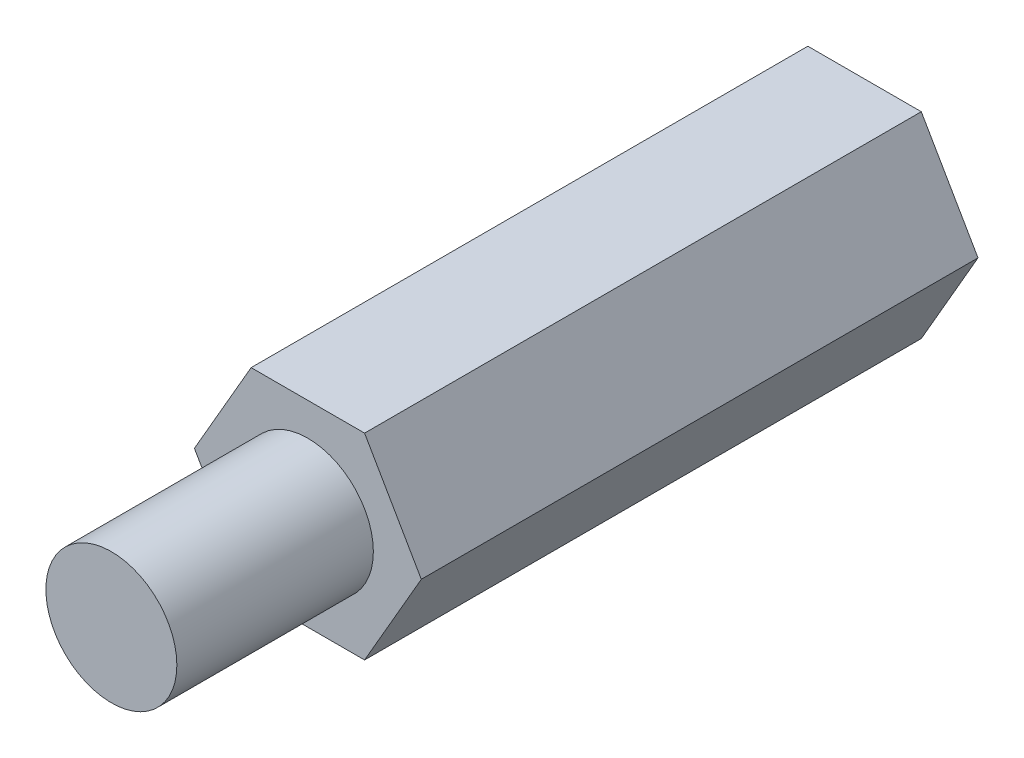
ISO-10303-21;
HEADER;
FILE_DESCRIPTION(('STEP AP214'),'2;1');
FILE_NAME('part.step','',(''),(''),'','','');
FILE_SCHEMA(('AUTOMOTIVE_DESIGN { 1 0 10303 214 1 1 1 1 }'));
ENDSEC;
DATA;
#1=APPLICATION_CONTEXT('core data for automotive mechanical design processes');
#2=APPLICATION_PROTOCOL_DEFINITION('international standard','automotive_design',2000,#1);
#3=PRODUCT_CONTEXT('',#1,'mechanical');
#4=PRODUCT('Part','Part','',(#3));
#5=PRODUCT_RELATED_PRODUCT_CATEGORY('part','',(#4));
#6=PRODUCT_DEFINITION_FORMATION('','',#4);
#7=PRODUCT_DEFINITION_CONTEXT('part definition',#1,'design');
#8=PRODUCT_DEFINITION('design','',#6,#7);
#9=PRODUCT_DEFINITION_SHAPE('','',#8);
#10=(LENGTH_UNIT() NAMED_UNIT(*) SI_UNIT(.MILLI.,.METRE.));
#11=(NAMED_UNIT(*) PLANE_ANGLE_UNIT() SI_UNIT($,.RADIAN.));
#12=(NAMED_UNIT(*) SI_UNIT($,.STERADIAN.) SOLID_ANGLE_UNIT());
#13=UNCERTAINTY_MEASURE_WITH_UNIT(LENGTH_MEASURE(1.E-05),#10,'distance_accuracy_value','');
#14=(GEOMETRIC_REPRESENTATION_CONTEXT(3) GLOBAL_UNCERTAINTY_ASSIGNED_CONTEXT((#13)) GLOBAL_UNIT_ASSIGNED_CONTEXT((#10,
#11,#12)) REPRESENTATION_CONTEXT('',''));
#15=CARTESIAN_POINT('',(0.,0.,0.));
#16=DIRECTION('',(0.,0.,1.));
#17=DIRECTION('',(1.,0.,0.));
#18=AXIS2_PLACEMENT_3D('',#15,#16,#17);
#19=CARTESIAN_POINT('',(3.46410161513775,0.,17.));
#20=DIRECTION('',(-0.866025403784439,-0.5,0.));
#21=DIRECTION('',(0.5,-0.866025403784438,0.));
#22=AXIS2_PLACEMENT_3D('',#19,#20,#21);
#23=PLANE('',#22);
#24=DIRECTION('',(-0.5,0.866025403784438,0.));
#25=VECTOR('',#24,1.);
#26=CARTESIAN_POINT('',(3.46410161513775,0.,0.));
#27=LINE('',#26,#25);
#28=CARTESIAN_POINT('',(3.46410161513775,0.,0.));
#29=VERTEX_POINT('',#28);
#30=CARTESIAN_POINT('',(1.73205080756888,3.,0.));
#31=VERTEX_POINT('',#30);
#32=EDGE_CURVE('E121',#29,#31,#27,.T.);
#33=ORIENTED_EDGE('',*,*,#32,.T.);
#34=DIRECTION('',(0.,0.,-1.));
#35=VECTOR('',#34,1.);
#36=CARTESIAN_POINT('',(1.73205080756888,3.,17.));
#37=LINE('',#36,#35);
#38=CARTESIAN_POINT('',(1.73205080756888,3.,17.));
#39=VERTEX_POINT('',#38);
#40=EDGE_CURVE('E36',#39,#31,#37,.T.);
#41=ORIENTED_EDGE('',*,*,#40,.F.);
#42=DIRECTION('',(-0.5,0.866025403784438,0.));
#43=VECTOR('',#42,1.);
#44=CARTESIAN_POINT('',(3.46410161513775,0.,17.));
#45=LINE('',#44,#43);
#46=CARTESIAN_POINT('',(3.46410161513775,0.,17.));
#47=VERTEX_POINT('',#46);
#48=EDGE_CURVE('E132',#47,#39,#45,.T.);
#49=ORIENTED_EDGE('',*,*,#48,.F.);
#50=DIRECTION('',(0.,0.,-1.));
#51=VECTOR('',#50,1.);
#52=CARTESIAN_POINT('',(3.46410161513775,0.,17.));
#53=LINE('',#52,#51);
#54=EDGE_CURVE('E117',#47,#29,#53,.T.);
#55=ORIENTED_EDGE('',*,*,#54,.T.);
#56=EDGE_LOOP('',(#33,#41,#49,#55));
#57=FACE_BOUND('',#56,.T.);
#58=ADVANCED_FACE('F33',(#57),#23,.F.);
#59=CARTESIAN_POINT('',(1.73205080756888,3.,17.));
#60=DIRECTION('',(0.,-1.,0.));
#61=DIRECTION('',(0.,0.,-1.));
#62=AXIS2_PLACEMENT_3D('',#59,#60,#61);
#63=PLANE('',#62);
#64=DIRECTION('',(-1.,0.,0.));
#65=VECTOR('',#64,1.);
#66=CARTESIAN_POINT('',(1.73205080756888,3.,0.));
#67=LINE('',#66,#65);
#68=CARTESIAN_POINT('',(-1.73205080756888,3.,0.));
#69=VERTEX_POINT('',#68);
#70=EDGE_CURVE('E124',#31,#69,#67,.T.);
#71=ORIENTED_EDGE('',*,*,#70,.T.);
#72=DIRECTION('',(0.,0.,-1.));
#73=VECTOR('',#72,1.);
#74=CARTESIAN_POINT('',(-1.73205080756888,3.,17.));
#75=LINE('',#74,#73);
#76=CARTESIAN_POINT('',(-1.73205080756888,3.,17.));
#77=VERTEX_POINT('',#76);
#78=EDGE_CURVE('E135',#77,#69,#75,.T.);
#79=ORIENTED_EDGE('',*,*,#78,.F.);
#80=DIRECTION('',(-1.,0.,0.));
#81=VECTOR('',#80,1.);
#82=CARTESIAN_POINT('',(1.73205080756888,3.,17.));
#83=LINE('',#82,#81);
#84=EDGE_CURVE('E89',#39,#77,#83,.T.);
#85=ORIENTED_EDGE('',*,*,#84,.F.);
#86=ORIENTED_EDGE('',*,*,#40,.T.);
#87=EDGE_LOOP('',(#71,#79,#85,#86));
#88=FACE_BOUND('',#87,.T.);
#89=ADVANCED_FACE('F140',(#88),#63,.F.);
#90=CARTESIAN_POINT('',(-1.73205080756888,3.,17.));
#91=DIRECTION('',(0.866025403784439,-0.5,0.));
#92=DIRECTION('',(0.5,0.866025403784439,0.));
#93=AXIS2_PLACEMENT_3D('',#90,#91,#92);
#94=PLANE('',#93);
#95=DIRECTION('',(-0.499999999999999,-0.866025403784439,0.));
#96=VECTOR('',#95,1.);
#97=CARTESIAN_POINT('',(-1.73205080756888,3.,0.));
#98=LINE('',#97,#96);
#99=CARTESIAN_POINT('',(-3.46410161513775,0.,0.));
#100=VERTEX_POINT('',#99);
#101=EDGE_CURVE('E127',#69,#100,#98,.T.);
#102=ORIENTED_EDGE('',*,*,#101,.T.);
#103=DIRECTION('',(0.,0.,-1.));
#104=VECTOR('',#103,1.);
#105=CARTESIAN_POINT('',(-3.46410161513775,0.,17.));
#106=LINE('',#105,#104);
#107=CARTESIAN_POINT('',(-3.46410161513775,0.,17.));
#108=VERTEX_POINT('',#107);
#109=EDGE_CURVE('E112',#108,#100,#106,.T.);
#110=ORIENTED_EDGE('',*,*,#109,.F.);
#111=DIRECTION('',(-0.499999999999999,-0.866025403784439,0.));
#112=VECTOR('',#111,1.);
#113=CARTESIAN_POINT('',(-1.73205080756888,3.,17.));
#114=LINE('',#113,#112);
#115=EDGE_CURVE('E103',#77,#108,#114,.T.);
#116=ORIENTED_EDGE('',*,*,#115,.F.);
#117=ORIENTED_EDGE('',*,*,#78,.T.);
#118=EDGE_LOOP('',(#102,#110,#116,#117));
#119=FACE_BOUND('',#118,.T.);
#120=ADVANCED_FACE('F146',(#119),#94,.F.);
#121=CARTESIAN_POINT('',(-3.46410161513775,0.,17.));
#122=DIRECTION('',(0.866025403784438,0.5,0.));
#123=DIRECTION('',(-0.5,0.866025403784438,0.));
#124=AXIS2_PLACEMENT_3D('',#121,#122,#123);
#125=PLANE('',#124);
#126=DIRECTION('',(0.5,-0.866025403784438,0.));
#127=VECTOR('',#126,1.);
#128=CARTESIAN_POINT('',(-3.46410161513775,0.,0.));
#129=LINE('',#128,#127);
#130=CARTESIAN_POINT('',(-1.73205080756887,-3.,0.));
#131=VERTEX_POINT('',#130);
#132=EDGE_CURVE('E111',#100,#131,#129,.T.);
#133=ORIENTED_EDGE('',*,*,#132,.T.);
#134=DIRECTION('',(0.,0.,-1.));
#135=VECTOR('',#134,1.);
#136=CARTESIAN_POINT('',(-1.73205080756887,-3.,17.));
#137=LINE('',#136,#135);
#138=CARTESIAN_POINT('',(-1.73205080756887,-3.,17.));
#139=VERTEX_POINT('',#138);
#140=EDGE_CURVE('E108',#139,#131,#137,.T.);
#141=ORIENTED_EDGE('',*,*,#140,.F.);
#142=DIRECTION('',(0.5,-0.866025403784438,0.));
#143=VECTOR('',#142,1.);
#144=CARTESIAN_POINT('',(-3.46410161513775,0.,17.));
#145=LINE('',#144,#143);
#146=EDGE_CURVE('E97',#108,#139,#145,.T.);
#147=ORIENTED_EDGE('',*,*,#146,.F.);
#148=ORIENTED_EDGE('',*,*,#109,.T.);
#149=EDGE_LOOP('',(#133,#141,#147,#148));
#150=FACE_BOUND('',#149,.T.);
#151=ADVANCED_FACE('F109',(#150),#125,.F.);
#152=CARTESIAN_POINT('',(-1.73205080756887,-3.,17.));
#153=DIRECTION('',(0.,1.,0.));
#154=DIRECTION('',(-1.,0.,0.));
#155=AXIS2_PLACEMENT_3D('',#152,#153,#154);
#156=PLANE('',#155);
#157=DIRECTION('',(1.,0.,0.));
#158=VECTOR('',#157,1.);
#159=CARTESIAN_POINT('',(-1.73205080756887,-3.,0.));
#160=LINE('',#159,#158);
#161=CARTESIAN_POINT('',(1.73205080756888,-3.,0.));
#162=VERTEX_POINT('',#161);
#163=EDGE_CURVE('E74',#131,#162,#160,.T.);
#164=ORIENTED_EDGE('',*,*,#163,.T.);
#165=DIRECTION('',(0.,0.,-1.));
#166=VECTOR('',#165,1.);
#167=CARTESIAN_POINT('',(1.73205080756888,-3.,17.));
#168=LINE('',#167,#166);
#169=CARTESIAN_POINT('',(1.73205080756888,-3.,17.));
#170=VERTEX_POINT('',#169);
#171=EDGE_CURVE('E113',#170,#162,#168,.T.);
#172=ORIENTED_EDGE('',*,*,#171,.F.);
#173=DIRECTION('',(1.,0.,0.));
#174=VECTOR('',#173,1.);
#175=CARTESIAN_POINT('',(-1.73205080756887,-3.,17.));
#176=LINE('',#175,#174);
#177=EDGE_CURVE('E101',#139,#170,#176,.T.);
#178=ORIENTED_EDGE('',*,*,#177,.F.);
#179=ORIENTED_EDGE('',*,*,#140,.T.);
#180=EDGE_LOOP('',(#164,#172,#178,#179));
#181=FACE_BOUND('',#180,.T.);
#182=ADVANCED_FACE('F115',(#181),#156,.F.);
#183=CARTESIAN_POINT('',(1.73205080756888,-3.,17.));
#184=DIRECTION('',(-0.866025403784439,0.5,0.));
#185=DIRECTION('',(-0.5,-0.866025403784439,0.));
#186=AXIS2_PLACEMENT_3D('',#183,#184,#185);
#187=PLANE('',#186);
#188=DIRECTION('',(0.5,0.866025403784439,0.));
#189=VECTOR('',#188,1.);
#190=CARTESIAN_POINT('',(1.73205080756888,-3.,0.));
#191=LINE('',#190,#189);
#192=EDGE_CURVE('E80',#162,#29,#191,.T.);
#193=ORIENTED_EDGE('',*,*,#192,.T.);
#194=ORIENTED_EDGE('',*,*,#54,.F.);
#195=DIRECTION('',(0.5,0.866025403784439,0.));
#196=VECTOR('',#195,1.);
#197=CARTESIAN_POINT('',(1.73205080756888,-3.,17.));
#198=LINE('',#197,#196);
#199=EDGE_CURVE('E50',#170,#47,#198,.T.);
#200=ORIENTED_EDGE('',*,*,#199,.F.);
#201=ORIENTED_EDGE('',*,*,#171,.T.);
#202=EDGE_LOOP('',(#193,#194,#200,#201));
#203=FACE_BOUND('',#202,.T.);
#204=ADVANCED_FACE('F171',(#203),#187,.F.);
#205=CARTESIAN_POINT('',(0.,0.,17.));
#206=DIRECTION('',(0.,0.,1.));
#207=DIRECTION('',(1.,0.,0.));
#208=AXIS2_PLACEMENT_3D('',#205,#206,#207);
#209=PLANE('',#208);
#210=CARTESIAN_POINT('',(0.,0.,17.));
#211=DIRECTION('',(0.,0.,1.));
#212=DIRECTION('',(1.,0.,0.));
#213=AXIS2_PLACEMENT_3D('',#210,#211,#212);
#214=CIRCLE('',#213,2.);
#215=CARTESIAN_POINT('',(2.,0.,17.));
#216=VERTEX_POINT('',#215);
#217=EDGE_CURVE('E11',#216,#216,#214,.T.);
#218=ORIENTED_EDGE('',*,*,#217,.F.);
#219=EDGE_LOOP('',(#218));
#220=FACE_BOUND('',#219,.T.);
#221=ORIENTED_EDGE('',*,*,#48,.T.);
#222=ORIENTED_EDGE('',*,*,#84,.T.);
#223=ORIENTED_EDGE('',*,*,#115,.T.);
#224=ORIENTED_EDGE('',*,*,#146,.T.);
#225=ORIENTED_EDGE('',*,*,#177,.T.);
#226=ORIENTED_EDGE('',*,*,#199,.T.);
#227=EDGE_LOOP('',(#221,#222,#223,#224,#225,#226));
#228=FACE_BOUND('',#227,.T.);
#229=ADVANCED_FACE('F99',(#220,#228),#209,.T.);
#230=CARTESIAN_POINT('',(0.,0.,0.));
#231=DIRECTION('',(0.,0.,1.));
#232=DIRECTION('',(1.,0.,0.));
#233=AXIS2_PLACEMENT_3D('',#230,#231,#232);
#234=PLANE('',#233);
#235=CARTESIAN_POINT('',(0.,0.,0.));
#236=DIRECTION('',(0.,0.,-1.));
#237=DIRECTION('',(-1.,0.,0.));
#238=AXIS2_PLACEMENT_3D('',#235,#236,#237);
#239=CIRCLE('',#238,1.49999999999999);
#240=CARTESIAN_POINT('',(-1.49999999999999,0.,0.));
#241=VERTEX_POINT('',#240);
#242=EDGE_CURVE('E155',#241,#241,#239,.T.);
#243=ORIENTED_EDGE('',*,*,#242,.F.);
#244=EDGE_LOOP('',(#243));
#245=FACE_BOUND('',#244,.T.);
#246=ORIENTED_EDGE('',*,*,#32,.F.);
#247=ORIENTED_EDGE('',*,*,#192,.F.);
#248=ORIENTED_EDGE('',*,*,#163,.F.);
#249=ORIENTED_EDGE('',*,*,#132,.F.);
#250=ORIENTED_EDGE('',*,*,#101,.F.);
#251=ORIENTED_EDGE('',*,*,#70,.F.);
#252=EDGE_LOOP('',(#246,#247,#248,#249,#250,#251));
#253=FACE_BOUND('',#252,.T.);
#254=ADVANCED_FACE('F145',(#245,#253),#234,.F.);
#255=CARTESIAN_POINT('',(0.,0.,23.));
#256=DIRECTION('',(0.,0.,-1.));
#257=DIRECTION('',(-1.,0.,0.));
#258=AXIS2_PLACEMENT_3D('',#255,#256,#257);
#259=CYLINDRICAL_SURFACE('',#258,2.);
#260=CARTESIAN_POINT('',(0.,0.,23.));
#261=DIRECTION('',(0.,0.,1.));
#262=DIRECTION('',(1.,0.,0.));
#263=AXIS2_PLACEMENT_3D('',#260,#261,#262);
#264=CIRCLE('',#263,2.);
#265=CARTESIAN_POINT('',(2.,0.,23.));
#266=VERTEX_POINT('',#265);
#267=EDGE_CURVE('E125',#266,#266,#264,.T.);
#268=ORIENTED_EDGE('',*,*,#267,.F.);
#269=EDGE_LOOP('',(#268));
#270=FACE_BOUND('',#269,.T.);
#271=ORIENTED_EDGE('',*,*,#217,.T.);
#272=EDGE_LOOP('',(#271));
#273=FACE_BOUND('',#272,.T.);
#274=ADVANCED_FACE('F162',(#270,#273),#259,.T.);
#275=CARTESIAN_POINT('',(0.,0.,23.));
#276=DIRECTION('',(0.,0.,1.));
#277=DIRECTION('',(1.,0.,0.));
#278=AXIS2_PLACEMENT_3D('',#275,#276,#277);
#279=PLANE('',#278);
#280=ORIENTED_EDGE('',*,*,#267,.T.);
#281=EDGE_LOOP('',(#280));
#282=FACE_BOUND('',#281,.T.);
#283=ADVANCED_FACE('F168',(#282),#279,.T.);
#284=CARTESIAN_POINT('',(0.,0.,6.));
#285=DIRECTION('',(0.,0.,-1.));
#286=DIRECTION('',(-1.,0.,0.));
#287=AXIS2_PLACEMENT_3D('',#284,#285,#286);
#288=CONICAL_SURFACE('',#287,1.5,1.02974425867665);
#289=CARTESIAN_POINT('',(0.,0.,6.90129092854134));
#290=VERTEX_POINT('',#289);
#291=VERTEX_LOOP('',#290);
#292=FACE_BOUND('',#291,.T.);
#293=CARTESIAN_POINT('',(0.,0.,6.));
#294=DIRECTION('',(0.,0.,-1.));
#295=DIRECTION('',(-1.,0.,0.));
#296=AXIS2_PLACEMENT_3D('',#293,#294,#295);
#297=CIRCLE('',#296,1.5);
#298=CARTESIAN_POINT('',(-1.5,0.,6.));
#299=VERTEX_POINT('',#298);
#300=EDGE_CURVE('E152',#299,#299,#297,.T.);
#301=ORIENTED_EDGE('',*,*,#300,.T.);
#302=EDGE_LOOP('',(#301));
#303=FACE_BOUND('',#302,.T.);
#304=ADVANCED_FACE('F211',(#292,#303),#288,.F.);
#305=CARTESIAN_POINT('',(0.,0.,0.));
#306=DIRECTION('',(0.,0.,-1.));
#307=DIRECTION('',(-1.,0.,0.));
#308=AXIS2_PLACEMENT_3D('',#305,#306,#307);
#309=CYLINDRICAL_SURFACE('',#308,1.49999999999999);
#310=ORIENTED_EDGE('',*,*,#300,.F.);
#311=EDGE_LOOP('',(#310));
#312=FACE_BOUND('',#311,.T.);
#313=ORIENTED_EDGE('',*,*,#242,.T.);
#314=EDGE_LOOP('',(#313));
#315=FACE_BOUND('',#314,.T.);
#316=ADVANCED_FACE('F159',(#312,#315),#309,.F.);
#317=CLOSED_SHELL('',(#58,#89,#120,#151,#182,#204,#229,#254,#274,#283,#304,#316));
#318=MANIFOLD_SOLID_BREP('B2',#317);
#319=ADVANCED_BREP_SHAPE_REPRESENTATION('',(#18,#318),#14);
#320=SHAPE_DEFINITION_REPRESENTATION(#9,#319);
ENDSEC;
END-ISO-10303-21;
